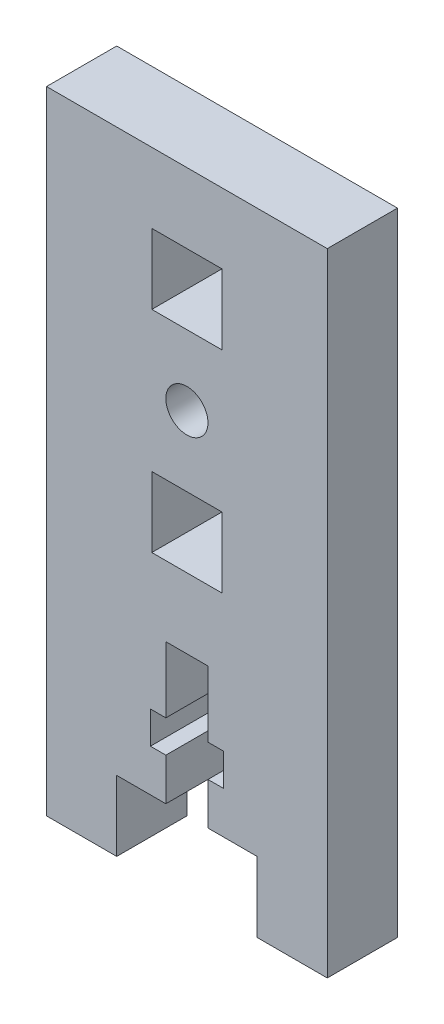
ISO-10303-21;
HEADER;
FILE_DESCRIPTION(('STEP AP214'),'2;1');
FILE_NAME('part.step','',(''),(''),'','','');
FILE_SCHEMA(('AUTOMOTIVE_DESIGN { 1 0 10303 214 1 1 1 1 }'));
ENDSEC;
DATA;
#1=APPLICATION_CONTEXT('core data for automotive mechanical design processes');
#2=APPLICATION_PROTOCOL_DEFINITION('international standard','automotive_design',2000,#1);
#3=PRODUCT_CONTEXT('',#1,'mechanical');
#4=PRODUCT('Part','Part','',(#3));
#5=PRODUCT_RELATED_PRODUCT_CATEGORY('part','',(#4));
#6=PRODUCT_DEFINITION_FORMATION('','',#4);
#7=PRODUCT_DEFINITION_CONTEXT('part definition',#1,'design');
#8=PRODUCT_DEFINITION('design','',#6,#7);
#9=PRODUCT_DEFINITION_SHAPE('','',#8);
#10=(LENGTH_UNIT() NAMED_UNIT(*) SI_UNIT(.MILLI.,.METRE.));
#11=(NAMED_UNIT(*) PLANE_ANGLE_UNIT() SI_UNIT($,.RADIAN.));
#12=(NAMED_UNIT(*) SI_UNIT($,.STERADIAN.) SOLID_ANGLE_UNIT());
#13=UNCERTAINTY_MEASURE_WITH_UNIT(LENGTH_MEASURE(1.E-05),#10,'distance_accuracy_value','');
#14=(GEOMETRIC_REPRESENTATION_CONTEXT(3) GLOBAL_UNCERTAINTY_ASSIGNED_CONTEXT((#13)) GLOBAL_UNIT_ASSIGNED_CONTEXT((#10,
#11,#12)) REPRESENTATION_CONTEXT('',''));
#15=CARTESIAN_POINT('',(0.,0.,0.));
#16=DIRECTION('',(0.,0.,1.));
#17=DIRECTION('',(1.,0.,0.));
#18=AXIS2_PLACEMENT_3D('',#15,#16,#17);
#19=CARTESIAN_POINT('',(0.,0.,5.));
#20=DIRECTION('',(0.,0.,-1.));
#21=DIRECTION('',(-1.,0.,0.));
#22=AXIS2_PLACEMENT_3D('',#19,#20,#21);
#23=PLANE('',#22);
#24=DIRECTION('',(-1.,0.,0.));
#25=VECTOR('',#24,1.);
#26=CARTESIAN_POINT('',(7.50000000000001,20.,5.));
#27=LINE('',#26,#25);
#28=CARTESIAN_POINT('',(12.5,20.,5.));
#29=VERTEX_POINT('',#28);
#30=CARTESIAN_POINT('',(7.50000000000001,20.,5.));
#31=VERTEX_POINT('',#30);
#32=EDGE_CURVE('E258',#29,#31,#27,.T.);
#33=ORIENTED_EDGE('',*,*,#32,.F.);
#34=DIRECTION('',(0.,1.,0.));
#35=VECTOR('',#34,1.);
#36=CARTESIAN_POINT('',(12.5,20.,5.));
#37=LINE('',#36,#35);
#38=CARTESIAN_POINT('',(12.5,15.,5.));
#39=VERTEX_POINT('',#38);
#40=EDGE_CURVE('E266',#39,#29,#37,.T.);
#41=ORIENTED_EDGE('',*,*,#40,.F.);
#42=DIRECTION('',(1.,0.,0.));
#43=VECTOR('',#42,1.);
#44=CARTESIAN_POINT('',(7.50000000000001,15.,5.));
#45=LINE('',#44,#43);
#46=CARTESIAN_POINT('',(7.50000000000001,15.,5.));
#47=VERTEX_POINT('',#46);
#48=EDGE_CURVE('E263',#47,#39,#45,.T.);
#49=ORIENTED_EDGE('',*,*,#48,.F.);
#50=DIRECTION('',(0.,-1.,0.));
#51=VECTOR('',#50,1.);
#52=CARTESIAN_POINT('',(7.50000000000001,20.,5.));
#53=LINE('',#52,#51);
#54=EDGE_CURVE('E260',#31,#47,#53,.T.);
#55=ORIENTED_EDGE('',*,*,#54,.F.);
#56=EDGE_LOOP('',(#33,#41,#49,#55));
#57=FACE_BOUND('',#56,.T.);
#58=DIRECTION('',(0.,-1.,0.));
#59=VECTOR('',#58,1.);
#60=CARTESIAN_POINT('',(0.,-5.,5.));
#61=LINE('',#60,#59);
#62=CARTESIAN_POINT('',(0.,40.,5.));
#63=VERTEX_POINT('',#62);
#64=CARTESIAN_POINT('',(0.,-5.,5.));
#65=VERTEX_POINT('',#64);
#66=EDGE_CURVE('E289',#63,#65,#61,.T.);
#67=ORIENTED_EDGE('',*,*,#66,.T.);
#68=DIRECTION('',(1.,0.,0.));
#69=VECTOR('',#68,1.);
#70=CARTESIAN_POINT('',(5.,-5.,5.));
#71=LINE('',#70,#69);
#72=CARTESIAN_POINT('',(5.,-5.,5.));
#73=VERTEX_POINT('',#72);
#74=EDGE_CURVE('E292',#65,#73,#71,.T.);
#75=ORIENTED_EDGE('',*,*,#74,.T.);
#76=DIRECTION('',(0.,1.,0.));
#77=VECTOR('',#76,1.);
#78=CARTESIAN_POINT('',(5.,-5.,5.));
#79=LINE('',#78,#77);
#80=CARTESIAN_POINT('',(5.,0.,5.));
#81=VERTEX_POINT('',#80);
#82=EDGE_CURVE('E295',#73,#81,#79,.T.);
#83=ORIENTED_EDGE('',*,*,#82,.T.);
#84=DIRECTION('',(1.,0.,0.));
#85=VECTOR('',#84,1.);
#86=CARTESIAN_POINT('',(8.50000000000001,0.,5.));
#87=LINE('',#86,#85);
#88=CARTESIAN_POINT('',(8.50000000000001,0.,5.));
#89=VERTEX_POINT('',#88);
#90=EDGE_CURVE('E297',#81,#89,#87,.T.);
#91=ORIENTED_EDGE('',*,*,#90,.T.);
#92=DIRECTION('',(0.,1.,0.));
#93=VECTOR('',#92,1.);
#94=CARTESIAN_POINT('',(8.5,3.,5.));
#95=LINE('',#94,#93);
#96=CARTESIAN_POINT('',(8.5,3.,5.));
#97=VERTEX_POINT('',#96);
#98=EDGE_CURVE('E299',#89,#97,#95,.T.);
#99=ORIENTED_EDGE('',*,*,#98,.T.);
#100=DIRECTION('',(-1.,0.,0.));
#101=VECTOR('',#100,1.);
#102=CARTESIAN_POINT('',(8.5,3.,5.));
#103=LINE('',#102,#101);
#104=CARTESIAN_POINT('',(7.4,3.00000000000001,5.));
#105=VERTEX_POINT('',#104);
#106=EDGE_CURVE('E301',#97,#105,#103,.T.);
#107=ORIENTED_EDGE('',*,*,#106,.T.);
#108=DIRECTION('',(0.,1.,0.));
#109=VECTOR('',#108,1.);
#110=CARTESIAN_POINT('',(7.4,3.00000000000001,5.));
#111=LINE('',#110,#109);
#112=CARTESIAN_POINT('',(7.4,5.3,5.));
#113=VERTEX_POINT('',#112);
#114=EDGE_CURVE('E303',#105,#113,#111,.T.);
#115=ORIENTED_EDGE('',*,*,#114,.T.);
#116=DIRECTION('',(1.,0.,0.));
#117=VECTOR('',#116,1.);
#118=CARTESIAN_POINT('',(7.4,5.3,5.));
#119=LINE('',#118,#117);
#120=CARTESIAN_POINT('',(8.5,5.29999999999999,5.));
#121=VERTEX_POINT('',#120);
#122=EDGE_CURVE('E305',#113,#121,#119,.T.);
#123=ORIENTED_EDGE('',*,*,#122,.T.);
#124=DIRECTION('',(0.,1.,0.));
#125=VECTOR('',#124,1.);
#126=CARTESIAN_POINT('',(8.5,10.,5.));
#127=LINE('',#126,#125);
#128=CARTESIAN_POINT('',(8.5,10.,5.));
#129=VERTEX_POINT('',#128);
#130=EDGE_CURVE('E307',#121,#129,#127,.T.);
#131=ORIENTED_EDGE('',*,*,#130,.T.);
#132=DIRECTION('',(1.,0.,0.));
#133=VECTOR('',#132,1.);
#134=CARTESIAN_POINT('',(11.5,10.,5.));
#135=LINE('',#134,#133);
#136=CARTESIAN_POINT('',(11.5,10.,5.));
#137=VERTEX_POINT('',#136);
#138=EDGE_CURVE('E309',#129,#137,#135,.T.);
#139=ORIENTED_EDGE('',*,*,#138,.T.);
#140=DIRECTION('',(0.,-1.,0.));
#141=VECTOR('',#140,1.);
#142=CARTESIAN_POINT('',(11.5,5.29999999999999,5.));
#143=LINE('',#142,#141);
#144=CARTESIAN_POINT('',(11.5,5.29999999999999,5.));
#145=VERTEX_POINT('',#144);
#146=EDGE_CURVE('E311',#137,#145,#143,.T.);
#147=ORIENTED_EDGE('',*,*,#146,.T.);
#148=DIRECTION('',(1.,0.,0.));
#149=VECTOR('',#148,1.);
#150=CARTESIAN_POINT('',(11.5,5.29999999999999,5.));
#151=LINE('',#150,#149);
#152=CARTESIAN_POINT('',(12.6,5.3,5.));
#153=VERTEX_POINT('',#152);
#154=EDGE_CURVE('E313',#145,#153,#151,.T.);
#155=ORIENTED_EDGE('',*,*,#154,.T.);
#156=DIRECTION('',(0.,-1.,0.));
#157=VECTOR('',#156,1.);
#158=CARTESIAN_POINT('',(12.6,5.3,5.));
#159=LINE('',#158,#157);
#160=CARTESIAN_POINT('',(12.6,3.,5.));
#161=VERTEX_POINT('',#160);
#162=EDGE_CURVE('E315',#153,#161,#159,.T.);
#163=ORIENTED_EDGE('',*,*,#162,.T.);
#164=DIRECTION('',(-1.,0.,0.));
#165=VECTOR('',#164,1.);
#166=CARTESIAN_POINT('',(12.6,3.,5.));
#167=LINE('',#166,#165);
#168=CARTESIAN_POINT('',(11.5,3.,5.));
#169=VERTEX_POINT('',#168);
#170=EDGE_CURVE('E317',#161,#169,#167,.T.);
#171=ORIENTED_EDGE('',*,*,#170,.T.);
#172=DIRECTION('',(0.,-1.,0.));
#173=VECTOR('',#172,1.);
#174=CARTESIAN_POINT('',(11.5,0.,5.));
#175=LINE('',#174,#173);
#176=CARTESIAN_POINT('',(11.5,0.,5.));
#177=VERTEX_POINT('',#176);
#178=EDGE_CURVE('E319',#169,#177,#175,.T.);
#179=ORIENTED_EDGE('',*,*,#178,.T.);
#180=DIRECTION('',(1.,0.,0.));
#181=VECTOR('',#180,1.);
#182=CARTESIAN_POINT('',(11.5,0.,5.));
#183=LINE('',#182,#181);
#184=CARTESIAN_POINT('',(15.,0.,5.));
#185=VERTEX_POINT('',#184);
#186=EDGE_CURVE('E321',#177,#185,#183,.T.);
#187=ORIENTED_EDGE('',*,*,#186,.T.);
#188=DIRECTION('',(0.,-1.,0.));
#189=VECTOR('',#188,1.);
#190=CARTESIAN_POINT('',(15.,0.,5.));
#191=LINE('',#190,#189);
#192=CARTESIAN_POINT('',(15.,-5.,5.));
#193=VERTEX_POINT('',#192);
#194=EDGE_CURVE('E323',#185,#193,#191,.T.);
#195=ORIENTED_EDGE('',*,*,#194,.T.);
#196=DIRECTION('',(1.,0.,0.));
#197=VECTOR('',#196,1.);
#198=CARTESIAN_POINT('',(15.,-5.,5.));
#199=LINE('',#198,#197);
#200=CARTESIAN_POINT('',(20.,-5.,5.));
#201=VERTEX_POINT('',#200);
#202=EDGE_CURVE('E325',#193,#201,#199,.T.);
#203=ORIENTED_EDGE('',*,*,#202,.T.);
#204=DIRECTION('',(0.,1.,0.));
#205=VECTOR('',#204,1.);
#206=CARTESIAN_POINT('',(20.,-5.,5.));
#207=LINE('',#206,#205);
#208=CARTESIAN_POINT('',(20.,40.,5.));
#209=VERTEX_POINT('',#208);
#210=EDGE_CURVE('E327',#201,#209,#207,.T.);
#211=ORIENTED_EDGE('',*,*,#210,.T.);
#212=DIRECTION('',(-1.,0.,0.));
#213=VECTOR('',#212,1.);
#214=CARTESIAN_POINT('',(0.,40.,5.));
#215=LINE('',#214,#213);
#216=EDGE_CURVE('E329',#209,#63,#215,.T.);
#217=ORIENTED_EDGE('',*,*,#216,.T.);
#218=EDGE_LOOP('',(#67,#75,#83,#91,#99,#107,#115,#123,#131,#139,#147,#155,#163,#171,#179,#187,
#195,#203,#211,#217));
#219=FACE_BOUND('',#218,.T.);
#220=DIRECTION('',(1.,0.,0.));
#221=VECTOR('',#220,1.);
#222=CARTESIAN_POINT('',(7.50000000000001,30.,5.));
#223=LINE('',#222,#221);
#224=CARTESIAN_POINT('',(7.50000000000001,30.,5.));
#225=VERTEX_POINT('',#224);
#226=CARTESIAN_POINT('',(12.5,30.,5.));
#227=VERTEX_POINT('',#226);
#228=EDGE_CURVE('E219',#225,#227,#223,.T.);
#229=ORIENTED_EDGE('',*,*,#228,.F.);
#230=DIRECTION('',(0.,-1.,0.));
#231=VECTOR('',#230,1.);
#232=CARTESIAN_POINT('',(7.50000000000001,30.,5.));
#233=LINE('',#232,#231);
#234=CARTESIAN_POINT('',(7.50000000000001,35.,5.));
#235=VERTEX_POINT('',#234);
#236=EDGE_CURVE('E242',#235,#225,#233,.T.);
#237=ORIENTED_EDGE('',*,*,#236,.F.);
#238=DIRECTION('',(-1.,0.,0.));
#239=VECTOR('',#238,1.);
#240=CARTESIAN_POINT('',(7.50000000000001,35.,5.));
#241=LINE('',#240,#239);
#242=CARTESIAN_POINT('',(12.5,35.,5.));
#243=VERTEX_POINT('',#242);
#244=EDGE_CURVE('E240',#243,#235,#241,.T.);
#245=ORIENTED_EDGE('',*,*,#244,.F.);
#246=DIRECTION('',(0.,1.,0.));
#247=VECTOR('',#246,1.);
#248=CARTESIAN_POINT('',(12.5,30.,5.));
#249=LINE('',#248,#247);
#250=EDGE_CURVE('E227',#227,#243,#249,.T.);
#251=ORIENTED_EDGE('',*,*,#250,.F.);
#252=EDGE_LOOP('',(#229,#237,#245,#251));
#253=FACE_BOUND('',#252,.T.);
#254=CARTESIAN_POINT('',(10.,25.,5.));
#255=DIRECTION('',(0.,0.,1.));
#256=DIRECTION('',(1.,0.,0.));
#257=AXIS2_PLACEMENT_3D('',#254,#255,#256);
#258=CIRCLE('',#257,1.5);
#259=CARTESIAN_POINT('',(11.5,25.,5.));
#260=VERTEX_POINT('',#259);
#261=EDGE_CURVE('E248',#260,#260,#258,.T.);
#262=ORIENTED_EDGE('',*,*,#261,.F.);
#263=EDGE_LOOP('',(#262));
#264=FACE_BOUND('',#263,.T.);
#265=ADVANCED_FACE('F34',(#57,#219,#253,#264),#23,.F.);
#266=CARTESIAN_POINT('',(0.,0.,0.));
#267=DIRECTION('',(0.,0.,-1.));
#268=DIRECTION('',(-1.,0.,0.));
#269=AXIS2_PLACEMENT_3D('',#266,#267,#268);
#270=PLANE('',#269);
#271=DIRECTION('',(0.,-1.,0.));
#272=VECTOR('',#271,1.);
#273=CARTESIAN_POINT('',(7.50000000000001,30.,0.));
#274=LINE('',#273,#272);
#275=CARTESIAN_POINT('',(7.50000000000001,35.,0.));
#276=VERTEX_POINT('',#275);
#277=CARTESIAN_POINT('',(7.50000000000001,30.,0.));
#278=VERTEX_POINT('',#277);
#279=EDGE_CURVE('E228',#276,#278,#274,.T.);
#280=ORIENTED_EDGE('',*,*,#279,.T.);
#281=DIRECTION('',(1.,0.,0.));
#282=VECTOR('',#281,1.);
#283=CARTESIAN_POINT('',(7.50000000000001,30.,0.));
#284=LINE('',#283,#282);
#285=CARTESIAN_POINT('',(12.5,30.,0.));
#286=VERTEX_POINT('',#285);
#287=EDGE_CURVE('E57',#278,#286,#284,.T.);
#288=ORIENTED_EDGE('',*,*,#287,.T.);
#289=DIRECTION('',(0.,1.,0.));
#290=VECTOR('',#289,1.);
#291=CARTESIAN_POINT('',(12.5,30.,0.));
#292=LINE('',#291,#290);
#293=CARTESIAN_POINT('',(12.5,35.,0.));
#294=VERTEX_POINT('',#293);
#295=EDGE_CURVE('E234',#286,#294,#292,.T.);
#296=ORIENTED_EDGE('',*,*,#295,.T.);
#297=DIRECTION('',(-1.,0.,0.));
#298=VECTOR('',#297,1.);
#299=CARTESIAN_POINT('',(7.50000000000001,35.,0.));
#300=LINE('',#299,#298);
#301=EDGE_CURVE('E250',#294,#276,#300,.T.);
#302=ORIENTED_EDGE('',*,*,#301,.T.);
#303=EDGE_LOOP('',(#280,#288,#296,#302));
#304=FACE_BOUND('',#303,.T.);
#305=DIRECTION('',(0.,1.,0.));
#306=VECTOR('',#305,1.);
#307=CARTESIAN_POINT('',(12.5,20.,0.));
#308=LINE('',#307,#306);
#309=CARTESIAN_POINT('',(12.5,15.,0.));
#310=VERTEX_POINT('',#309);
#311=CARTESIAN_POINT('',(12.5,20.,0.));
#312=VERTEX_POINT('',#311);
#313=EDGE_CURVE('E261',#310,#312,#308,.T.);
#314=ORIENTED_EDGE('',*,*,#313,.T.);
#315=DIRECTION('',(-1.,0.,0.));
#316=VECTOR('',#315,1.);
#317=CARTESIAN_POINT('',(7.50000000000001,20.,0.));
#318=LINE('',#317,#316);
#319=CARTESIAN_POINT('',(7.50000000000001,20.,0.));
#320=VERTEX_POINT('',#319);
#321=EDGE_CURVE('E235',#312,#320,#318,.T.);
#322=ORIENTED_EDGE('',*,*,#321,.T.);
#323=DIRECTION('',(0.,-1.,0.));
#324=VECTOR('',#323,1.);
#325=CARTESIAN_POINT('',(7.50000000000001,20.,0.));
#326=LINE('',#325,#324);
#327=CARTESIAN_POINT('',(7.50000000000001,15.,0.));
#328=VERTEX_POINT('',#327);
#329=EDGE_CURVE('E271',#320,#328,#326,.T.);
#330=ORIENTED_EDGE('',*,*,#329,.T.);
#331=DIRECTION('',(1.,0.,0.));
#332=VECTOR('',#331,1.);
#333=CARTESIAN_POINT('',(7.50000000000001,15.,0.));
#334=LINE('',#333,#332);
#335=EDGE_CURVE('E274',#328,#310,#334,.T.);
#336=ORIENTED_EDGE('',*,*,#335,.T.);
#337=EDGE_LOOP('',(#314,#322,#330,#336));
#338=FACE_BOUND('',#337,.T.);
#339=DIRECTION('',(1.,0.,0.));
#340=VECTOR('',#339,1.);
#341=CARTESIAN_POINT('',(5.,-5.,0.));
#342=LINE('',#341,#340);
#343=CARTESIAN_POINT('',(0.,-5.,0.));
#344=VERTEX_POINT('',#343);
#345=CARTESIAN_POINT('',(5.,-5.,0.));
#346=VERTEX_POINT('',#345);
#347=EDGE_CURVE('E288',#344,#346,#342,.T.);
#348=ORIENTED_EDGE('',*,*,#347,.F.);
#349=DIRECTION('',(0.,-1.,0.));
#350=VECTOR('',#349,1.);
#351=CARTESIAN_POINT('',(0.,0.,0.));
#352=LINE('',#351,#350);
#353=CARTESIAN_POINT('',(0.,40.,0.));
#354=VERTEX_POINT('',#353);
#355=EDGE_CURVE('E293',#354,#344,#352,.T.);
#356=ORIENTED_EDGE('',*,*,#355,.F.);
#357=DIRECTION('',(-1.,0.,0.));
#358=VECTOR('',#357,1.);
#359=CARTESIAN_POINT('',(0.,40.,0.));
#360=LINE('',#359,#358);
#361=CARTESIAN_POINT('',(20.,40.,0.));
#362=VERTEX_POINT('',#361);
#363=EDGE_CURVE('E369',#362,#354,#360,.T.);
#364=ORIENTED_EDGE('',*,*,#363,.F.);
#365=DIRECTION('',(0.,1.,0.));
#366=VECTOR('',#365,1.);
#367=CARTESIAN_POINT('',(20.,0.,0.));
#368=LINE('',#367,#366);
#369=CARTESIAN_POINT('',(20.,-5.,0.));
#370=VERTEX_POINT('',#369);
#371=EDGE_CURVE('E367',#370,#362,#368,.T.);
#372=ORIENTED_EDGE('',*,*,#371,.F.);
#373=DIRECTION('',(1.,0.,0.));
#374=VECTOR('',#373,1.);
#375=CARTESIAN_POINT('',(15.,-5.,0.));
#376=LINE('',#375,#374);
#377=CARTESIAN_POINT('',(15.,-5.,0.));
#378=VERTEX_POINT('',#377);
#379=EDGE_CURVE('E364',#378,#370,#376,.T.);
#380=ORIENTED_EDGE('',*,*,#379,.F.);
#381=DIRECTION('',(0.,-1.,0.));
#382=VECTOR('',#381,1.);
#383=CARTESIAN_POINT('',(15.,0.,0.));
#384=LINE('',#383,#382);
#385=CARTESIAN_POINT('',(15.,0.,0.));
#386=VERTEX_POINT('',#385);
#387=EDGE_CURVE('E362',#386,#378,#384,.T.);
#388=ORIENTED_EDGE('',*,*,#387,.F.);
#389=DIRECTION('',(1.,0.,0.));
#390=VECTOR('',#389,1.);
#391=CARTESIAN_POINT('',(11.5,0.,0.));
#392=LINE('',#391,#390);
#393=CARTESIAN_POINT('',(11.5,0.,0.));
#394=VERTEX_POINT('',#393);
#395=EDGE_CURVE('E360',#394,#386,#392,.T.);
#396=ORIENTED_EDGE('',*,*,#395,.F.);
#397=DIRECTION('',(0.,-1.,0.));
#398=VECTOR('',#397,1.);
#399=CARTESIAN_POINT('',(11.5,0.,0.));
#400=LINE('',#399,#398);
#401=CARTESIAN_POINT('',(11.5,3.,0.));
#402=VERTEX_POINT('',#401);
#403=EDGE_CURVE('E358',#402,#394,#400,.T.);
#404=ORIENTED_EDGE('',*,*,#403,.F.);
#405=DIRECTION('',(-1.,0.,0.));
#406=VECTOR('',#405,1.);
#407=CARTESIAN_POINT('',(12.6,3.,0.));
#408=LINE('',#407,#406);
#409=CARTESIAN_POINT('',(12.6,3.,0.));
#410=VERTEX_POINT('',#409);
#411=EDGE_CURVE('E356',#410,#402,#408,.T.);
#412=ORIENTED_EDGE('',*,*,#411,.F.);
#413=DIRECTION('',(0.,-1.,0.));
#414=VECTOR('',#413,1.);
#415=CARTESIAN_POINT('',(12.6,5.3,0.));
#416=LINE('',#415,#414);
#417=CARTESIAN_POINT('',(12.6,5.3,0.));
#418=VERTEX_POINT('',#417);
#419=EDGE_CURVE('E354',#418,#410,#416,.T.);
#420=ORIENTED_EDGE('',*,*,#419,.F.);
#421=DIRECTION('',(1.,0.,0.));
#422=VECTOR('',#421,1.);
#423=CARTESIAN_POINT('',(11.5,5.29999999999999,0.));
#424=LINE('',#423,#422);
#425=CARTESIAN_POINT('',(11.5,5.29999999999999,0.));
#426=VERTEX_POINT('',#425);
#427=EDGE_CURVE('E352',#426,#418,#424,.T.);
#428=ORIENTED_EDGE('',*,*,#427,.F.);
#429=DIRECTION('',(0.,-1.,0.));
#430=VECTOR('',#429,1.);
#431=CARTESIAN_POINT('',(11.5,5.29999999999999,0.));
#432=LINE('',#431,#430);
#433=CARTESIAN_POINT('',(11.5,10.,0.));
#434=VERTEX_POINT('',#433);
#435=EDGE_CURVE('E350',#434,#426,#432,.T.);
#436=ORIENTED_EDGE('',*,*,#435,.F.);
#437=DIRECTION('',(1.,0.,0.));
#438=VECTOR('',#437,1.);
#439=CARTESIAN_POINT('',(11.5,10.,0.));
#440=LINE('',#439,#438);
#441=CARTESIAN_POINT('',(8.5,10.,0.));
#442=VERTEX_POINT('',#441);
#443=EDGE_CURVE('E348',#442,#434,#440,.T.);
#444=ORIENTED_EDGE('',*,*,#443,.F.);
#445=DIRECTION('',(0.,1.,0.));
#446=VECTOR('',#445,1.);
#447=CARTESIAN_POINT('',(8.5,10.,0.));
#448=LINE('',#447,#446);
#449=CARTESIAN_POINT('',(8.5,5.29999999999999,0.));
#450=VERTEX_POINT('',#449);
#451=EDGE_CURVE('E346',#450,#442,#448,.T.);
#452=ORIENTED_EDGE('',*,*,#451,.F.);
#453=DIRECTION('',(1.,0.,0.));
#454=VECTOR('',#453,1.);
#455=CARTESIAN_POINT('',(7.4,5.3,0.));
#456=LINE('',#455,#454);
#457=CARTESIAN_POINT('',(7.4,5.3,0.));
#458=VERTEX_POINT('',#457);
#459=EDGE_CURVE('E344',#458,#450,#456,.T.);
#460=ORIENTED_EDGE('',*,*,#459,.F.);
#461=DIRECTION('',(0.,1.,0.));
#462=VECTOR('',#461,1.);
#463=CARTESIAN_POINT('',(7.4,3.00000000000001,0.));
#464=LINE('',#463,#462);
#465=CARTESIAN_POINT('',(7.4,3.00000000000001,0.));
#466=VERTEX_POINT('',#465);
#467=EDGE_CURVE('E342',#466,#458,#464,.T.);
#468=ORIENTED_EDGE('',*,*,#467,.F.);
#469=DIRECTION('',(-1.,0.,0.));
#470=VECTOR('',#469,1.);
#471=CARTESIAN_POINT('',(8.5,3.,0.));
#472=LINE('',#471,#470);
#473=CARTESIAN_POINT('',(8.5,3.,0.));
#474=VERTEX_POINT('',#473);
#475=EDGE_CURVE('E340',#474,#466,#472,.T.);
#476=ORIENTED_EDGE('',*,*,#475,.F.);
#477=DIRECTION('',(0.,1.,0.));
#478=VECTOR('',#477,1.);
#479=CARTESIAN_POINT('',(8.5,3.,0.));
#480=LINE('',#479,#478);
#481=CARTESIAN_POINT('',(8.50000000000001,0.,0.));
#482=VERTEX_POINT('',#481);
#483=EDGE_CURVE('E338',#482,#474,#480,.T.);
#484=ORIENTED_EDGE('',*,*,#483,.F.);
#485=DIRECTION('',(1.,0.,0.));
#486=VECTOR('',#485,1.);
#487=CARTESIAN_POINT('',(8.50000000000001,0.,0.));
#488=LINE('',#487,#486);
#489=CARTESIAN_POINT('',(5.,0.,0.));
#490=VERTEX_POINT('',#489);
#491=EDGE_CURVE('E336',#490,#482,#488,.T.);
#492=ORIENTED_EDGE('',*,*,#491,.F.);
#493=DIRECTION('',(0.,1.,0.));
#494=VECTOR('',#493,1.);
#495=CARTESIAN_POINT('',(5.,-5.,0.));
#496=LINE('',#495,#494);
#497=EDGE_CURVE('E334',#346,#490,#496,.T.);
#498=ORIENTED_EDGE('',*,*,#497,.F.);
#499=EDGE_LOOP('',(#348,#356,#364,#372,#380,#388,#396,#404,#412,#420,#428,#436,#444,#452,#460,
#468,#476,#484,#492,#498));
#500=FACE_BOUND('',#499,.T.);
#501=CARTESIAN_POINT('',(10.,25.,0.));
#502=DIRECTION('',(0.,0.,1.));
#503=DIRECTION('',(1.,0.,0.));
#504=AXIS2_PLACEMENT_3D('',#501,#502,#503);
#505=CIRCLE('',#504,1.5);
#506=CARTESIAN_POINT('',(11.5,25.,0.));
#507=VERTEX_POINT('',#506);
#508=EDGE_CURVE('E798',#507,#507,#505,.T.);
#509=ORIENTED_EDGE('',*,*,#508,.T.);
#510=EDGE_LOOP('',(#509));
#511=FACE_BOUND('',#510,.T.);
#512=ADVANCED_FACE('F435',(#304,#338,#500,#511),#270,.T.);
#513=CARTESIAN_POINT('',(5.,-5.,5.));
#514=DIRECTION('',(0.,1.,0.));
#515=DIRECTION('',(0.,0.,1.));
#516=AXIS2_PLACEMENT_3D('',#513,#514,#515);
#517=PLANE('',#516);
#518=ORIENTED_EDGE('',*,*,#347,.T.);
#519=DIRECTION('',(0.,0.,-1.));
#520=VECTOR('',#519,1.);
#521=CARTESIAN_POINT('',(5.,-5.,5.));
#522=LINE('',#521,#520);
#523=EDGE_CURVE('E42',#73,#346,#522,.T.);
#524=ORIENTED_EDGE('',*,*,#523,.F.);
#525=ORIENTED_EDGE('',*,*,#74,.F.);
#526=DIRECTION('',(0.,0.,-1.));
#527=VECTOR('',#526,1.);
#528=CARTESIAN_POINT('',(0.,-5.,5.));
#529=LINE('',#528,#527);
#530=EDGE_CURVE('E11',#65,#344,#529,.T.);
#531=ORIENTED_EDGE('',*,*,#530,.T.);
#532=EDGE_LOOP('',(#518,#524,#525,#531));
#533=FACE_BOUND('',#532,.T.);
#534=ADVANCED_FACE('F36',(#533),#517,.F.);
#535=CARTESIAN_POINT('',(5.,-5.,5.));
#536=DIRECTION('',(-1.,0.,0.));
#537=DIRECTION('',(0.,-1.,0.));
#538=AXIS2_PLACEMENT_3D('',#535,#536,#537);
#539=PLANE('',#538);
#540=ORIENTED_EDGE('',*,*,#497,.T.);
#541=DIRECTION('',(0.,0.,-1.));
#542=VECTOR('',#541,1.);
#543=CARTESIAN_POINT('',(5.,0.,5.));
#544=LINE('',#543,#542);
#545=EDGE_CURVE('E422',#81,#490,#544,.T.);
#546=ORIENTED_EDGE('',*,*,#545,.F.);
#547=ORIENTED_EDGE('',*,*,#82,.F.);
#548=ORIENTED_EDGE('',*,*,#523,.T.);
#549=EDGE_LOOP('',(#540,#546,#547,#548));
#550=FACE_BOUND('',#549,.T.);
#551=ADVANCED_FACE('F429',(#550),#539,.F.);
#552=CARTESIAN_POINT('',(8.50000000000001,0.,5.));
#553=DIRECTION('',(0.,1.,0.));
#554=DIRECTION('',(-1.,0.,0.));
#555=AXIS2_PLACEMENT_3D('',#552,#553,#554);
#556=PLANE('',#555);
#557=ORIENTED_EDGE('',*,*,#491,.T.);
#558=DIRECTION('',(0.,0.,-1.));
#559=VECTOR('',#558,1.);
#560=CARTESIAN_POINT('',(8.50000000000001,0.,5.));
#561=LINE('',#560,#559);
#562=EDGE_CURVE('E419',#89,#482,#561,.T.);
#563=ORIENTED_EDGE('',*,*,#562,.F.);
#564=ORIENTED_EDGE('',*,*,#90,.F.);
#565=ORIENTED_EDGE('',*,*,#545,.T.);
#566=EDGE_LOOP('',(#557,#563,#564,#565));
#567=FACE_BOUND('',#566,.T.);
#568=ADVANCED_FACE('F442',(#567),#556,.F.);
#569=CARTESIAN_POINT('',(8.5,3.,5.));
#570=DIRECTION('',(-1.,0.,0.));
#571=DIRECTION('',(0.,-1.,0.));
#572=AXIS2_PLACEMENT_3D('',#569,#570,#571);
#573=PLANE('',#572);
#574=ORIENTED_EDGE('',*,*,#483,.T.);
#575=DIRECTION('',(0.,0.,-1.));
#576=VECTOR('',#575,1.);
#577=CARTESIAN_POINT('',(8.5,3.,5.));
#578=LINE('',#577,#576);
#579=EDGE_CURVE('E416',#97,#474,#578,.T.);
#580=ORIENTED_EDGE('',*,*,#579,.F.);
#581=ORIENTED_EDGE('',*,*,#98,.F.);
#582=ORIENTED_EDGE('',*,*,#562,.T.);
#583=EDGE_LOOP('',(#574,#580,#581,#582));
#584=FACE_BOUND('',#583,.T.);
#585=ADVANCED_FACE('F446',(#584),#573,.F.);
#586=CARTESIAN_POINT('',(8.5,3.,5.));
#587=DIRECTION('',(0.,-1.,0.));
#588=DIRECTION('',(1.,0.,0.));
#589=AXIS2_PLACEMENT_3D('',#586,#587,#588);
#590=PLANE('',#589);
#591=ORIENTED_EDGE('',*,*,#475,.T.);
#592=DIRECTION('',(0.,0.,-1.));
#593=VECTOR('',#592,1.);
#594=CARTESIAN_POINT('',(7.4,3.00000000000001,5.));
#595=LINE('',#594,#593);
#596=EDGE_CURVE('E413',#105,#466,#595,.T.);
#597=ORIENTED_EDGE('',*,*,#596,.F.);
#598=ORIENTED_EDGE('',*,*,#106,.F.);
#599=ORIENTED_EDGE('',*,*,#579,.T.);
#600=EDGE_LOOP('',(#591,#597,#598,#599));
#601=FACE_BOUND('',#600,.T.);
#602=ADVANCED_FACE('F524',(#601),#590,.F.);
#603=CARTESIAN_POINT('',(7.4,3.00000000000001,5.));
#604=DIRECTION('',(-1.,0.,0.));
#605=DIRECTION('',(0.,-1.,0.));
#606=AXIS2_PLACEMENT_3D('',#603,#604,#605);
#607=PLANE('',#606);
#608=ORIENTED_EDGE('',*,*,#467,.T.);
#609=DIRECTION('',(0.,0.,-1.));
#610=VECTOR('',#609,1.);
#611=CARTESIAN_POINT('',(7.4,5.3,5.));
#612=LINE('',#611,#610);
#613=EDGE_CURVE('E410',#113,#458,#612,.T.);
#614=ORIENTED_EDGE('',*,*,#613,.F.);
#615=ORIENTED_EDGE('',*,*,#114,.F.);
#616=ORIENTED_EDGE('',*,*,#596,.T.);
#617=EDGE_LOOP('',(#608,#614,#615,#616));
#618=FACE_BOUND('',#617,.T.);
#619=ADVANCED_FACE('F522',(#618),#607,.F.);
#620=CARTESIAN_POINT('',(7.4,5.3,5.));
#621=DIRECTION('',(0.,1.,0.));
#622=DIRECTION('',(-1.,0.,0.));
#623=AXIS2_PLACEMENT_3D('',#620,#621,#622);
#624=PLANE('',#623);
#625=ORIENTED_EDGE('',*,*,#459,.T.);
#626=DIRECTION('',(0.,0.,-1.));
#627=VECTOR('',#626,1.);
#628=CARTESIAN_POINT('',(8.5,5.29999999999999,5.));
#629=LINE('',#628,#627);
#630=EDGE_CURVE('E407',#121,#450,#629,.T.);
#631=ORIENTED_EDGE('',*,*,#630,.F.);
#632=ORIENTED_EDGE('',*,*,#122,.F.);
#633=ORIENTED_EDGE('',*,*,#613,.T.);
#634=EDGE_LOOP('',(#625,#631,#632,#633));
#635=FACE_BOUND('',#634,.T.);
#636=ADVANCED_FACE('F517',(#635),#624,.F.);
#637=CARTESIAN_POINT('',(8.5,10.,5.));
#638=DIRECTION('',(-1.,0.,0.));
#639=DIRECTION('',(0.,-1.,0.));
#640=AXIS2_PLACEMENT_3D('',#637,#638,#639);
#641=PLANE('',#640);
#642=ORIENTED_EDGE('',*,*,#451,.T.);
#643=DIRECTION('',(0.,0.,-1.));
#644=VECTOR('',#643,1.);
#645=CARTESIAN_POINT('',(8.5,10.,5.));
#646=LINE('',#645,#644);
#647=EDGE_CURVE('E404',#129,#442,#646,.T.);
#648=ORIENTED_EDGE('',*,*,#647,.F.);
#649=ORIENTED_EDGE('',*,*,#130,.F.);
#650=ORIENTED_EDGE('',*,*,#630,.T.);
#651=EDGE_LOOP('',(#642,#648,#649,#650));
#652=FACE_BOUND('',#651,.T.);
#653=ADVANCED_FACE('F512',(#652),#641,.F.);
#654=CARTESIAN_POINT('',(11.5,10.,5.));
#655=DIRECTION('',(0.,1.,0.));
#656=DIRECTION('',(0.,0.,1.));
#657=AXIS2_PLACEMENT_3D('',#654,#655,#656);
#658=PLANE('',#657);
#659=ORIENTED_EDGE('',*,*,#443,.T.);
#660=DIRECTION('',(0.,0.,-1.));
#661=VECTOR('',#660,1.);
#662=CARTESIAN_POINT('',(11.5,10.,5.));
#663=LINE('',#662,#661);
#664=EDGE_CURVE('E401',#137,#434,#663,.T.);
#665=ORIENTED_EDGE('',*,*,#664,.F.);
#666=ORIENTED_EDGE('',*,*,#138,.F.);
#667=ORIENTED_EDGE('',*,*,#647,.T.);
#668=EDGE_LOOP('',(#659,#665,#666,#667));
#669=FACE_BOUND('',#668,.T.);
#670=ADVANCED_FACE('F508',(#669),#658,.F.);
#671=CARTESIAN_POINT('',(11.5,5.29999999999999,5.));
#672=DIRECTION('',(1.,0.,0.));
#673=DIRECTION('',(0.,0.,-1.));
#674=AXIS2_PLACEMENT_3D('',#671,#672,#673);
#675=PLANE('',#674);
#676=ORIENTED_EDGE('',*,*,#435,.T.);
#677=DIRECTION('',(0.,0.,-1.));
#678=VECTOR('',#677,1.);
#679=CARTESIAN_POINT('',(11.5,5.29999999999999,5.));
#680=LINE('',#679,#678);
#681=EDGE_CURVE('E398',#145,#426,#680,.T.);
#682=ORIENTED_EDGE('',*,*,#681,.F.);
#683=ORIENTED_EDGE('',*,*,#146,.F.);
#684=ORIENTED_EDGE('',*,*,#664,.T.);
#685=EDGE_LOOP('',(#676,#682,#683,#684));
#686=FACE_BOUND('',#685,.T.);
#687=ADVANCED_FACE('F503',(#686),#675,.F.);
#688=CARTESIAN_POINT('',(11.5,5.29999999999999,5.));
#689=DIRECTION('',(0.,1.,0.));
#690=DIRECTION('',(-1.,0.,0.));
#691=AXIS2_PLACEMENT_3D('',#688,#689,#690);
#692=PLANE('',#691);
#693=ORIENTED_EDGE('',*,*,#427,.T.);
#694=DIRECTION('',(0.,0.,-1.));
#695=VECTOR('',#694,1.);
#696=CARTESIAN_POINT('',(12.6,5.3,5.));
#697=LINE('',#696,#695);
#698=EDGE_CURVE('E395',#153,#418,#697,.T.);
#699=ORIENTED_EDGE('',*,*,#698,.F.);
#700=ORIENTED_EDGE('',*,*,#154,.F.);
#701=ORIENTED_EDGE('',*,*,#681,.T.);
#702=EDGE_LOOP('',(#693,#699,#700,#701));
#703=FACE_BOUND('',#702,.T.);
#704=ADVANCED_FACE('F497',(#703),#692,.F.);
#705=CARTESIAN_POINT('',(12.6,5.3,5.));
#706=DIRECTION('',(1.,0.,0.));
#707=DIRECTION('',(0.,1.,0.));
#708=AXIS2_PLACEMENT_3D('',#705,#706,#707);
#709=PLANE('',#708);
#710=ORIENTED_EDGE('',*,*,#419,.T.);
#711=DIRECTION('',(0.,0.,-1.));
#712=VECTOR('',#711,1.);
#713=CARTESIAN_POINT('',(12.6,3.,5.));
#714=LINE('',#713,#712);
#715=EDGE_CURVE('E392',#161,#410,#714,.T.);
#716=ORIENTED_EDGE('',*,*,#715,.F.);
#717=ORIENTED_EDGE('',*,*,#162,.F.);
#718=ORIENTED_EDGE('',*,*,#698,.T.);
#719=EDGE_LOOP('',(#710,#716,#717,#718));
#720=FACE_BOUND('',#719,.T.);
#721=ADVANCED_FACE('F493',(#720),#709,.F.);
#722=CARTESIAN_POINT('',(12.6,3.,5.));
#723=DIRECTION('',(0.,-1.,0.));
#724=DIRECTION('',(0.,0.,-1.));
#725=AXIS2_PLACEMENT_3D('',#722,#723,#724);
#726=PLANE('',#725);
#727=ORIENTED_EDGE('',*,*,#411,.T.);
#728=DIRECTION('',(0.,0.,-1.));
#729=VECTOR('',#728,1.);
#730=CARTESIAN_POINT('',(11.5,3.,5.));
#731=LINE('',#730,#729);
#732=EDGE_CURVE('E389',#169,#402,#731,.T.);
#733=ORIENTED_EDGE('',*,*,#732,.F.);
#734=ORIENTED_EDGE('',*,*,#170,.F.);
#735=ORIENTED_EDGE('',*,*,#715,.T.);
#736=EDGE_LOOP('',(#727,#733,#734,#735));
#737=FACE_BOUND('',#736,.T.);
#738=ADVANCED_FACE('F488',(#737),#726,.F.);
#739=CARTESIAN_POINT('',(11.5,0.,5.));
#740=DIRECTION('',(1.,0.,0.));
#741=DIRECTION('',(0.,1.,0.));
#742=AXIS2_PLACEMENT_3D('',#739,#740,#741);
#743=PLANE('',#742);
#744=ORIENTED_EDGE('',*,*,#403,.T.);
#745=DIRECTION('',(0.,0.,-1.));
#746=VECTOR('',#745,1.);
#747=CARTESIAN_POINT('',(11.5,0.,5.));
#748=LINE('',#747,#746);
#749=EDGE_CURVE('E386',#177,#394,#748,.T.);
#750=ORIENTED_EDGE('',*,*,#749,.F.);
#751=ORIENTED_EDGE('',*,*,#178,.F.);
#752=ORIENTED_EDGE('',*,*,#732,.T.);
#753=EDGE_LOOP('',(#744,#750,#751,#752));
#754=FACE_BOUND('',#753,.T.);
#755=ADVANCED_FACE('F482',(#754),#743,.F.);
#756=CARTESIAN_POINT('',(11.5,0.,5.));
#757=DIRECTION('',(0.,1.,0.));
#758=DIRECTION('',(-1.,0.,0.));
#759=AXIS2_PLACEMENT_3D('',#756,#757,#758);
#760=PLANE('',#759);
#761=ORIENTED_EDGE('',*,*,#395,.T.);
#762=DIRECTION('',(0.,0.,-1.));
#763=VECTOR('',#762,1.);
#764=CARTESIAN_POINT('',(15.,0.,5.));
#765=LINE('',#764,#763);
#766=EDGE_CURVE('E383',#185,#386,#765,.T.);
#767=ORIENTED_EDGE('',*,*,#766,.F.);
#768=ORIENTED_EDGE('',*,*,#186,.F.);
#769=ORIENTED_EDGE('',*,*,#749,.T.);
#770=EDGE_LOOP('',(#761,#767,#768,#769));
#771=FACE_BOUND('',#770,.T.);
#772=ADVANCED_FACE('F478',(#771),#760,.F.);
#773=CARTESIAN_POINT('',(15.,0.,5.));
#774=DIRECTION('',(1.,0.,0.));
#775=DIRECTION('',(0.,0.,-1.));
#776=AXIS2_PLACEMENT_3D('',#773,#774,#775);
#777=PLANE('',#776);
#778=ORIENTED_EDGE('',*,*,#387,.T.);
#779=DIRECTION('',(0.,0.,-1.));
#780=VECTOR('',#779,1.);
#781=CARTESIAN_POINT('',(15.,-5.,5.));
#782=LINE('',#781,#780);
#783=EDGE_CURVE('E380',#193,#378,#782,.T.);
#784=ORIENTED_EDGE('',*,*,#783,.F.);
#785=ORIENTED_EDGE('',*,*,#194,.F.);
#786=ORIENTED_EDGE('',*,*,#766,.T.);
#787=EDGE_LOOP('',(#778,#784,#785,#786));
#788=FACE_BOUND('',#787,.T.);
#789=ADVANCED_FACE('F473',(#788),#777,.F.);
#790=CARTESIAN_POINT('',(15.,-5.,5.));
#791=DIRECTION('',(0.,1.,0.));
#792=DIRECTION('',(0.,0.,1.));
#793=AXIS2_PLACEMENT_3D('',#790,#791,#792);
#794=PLANE('',#793);
#795=ORIENTED_EDGE('',*,*,#379,.T.);
#796=DIRECTION('',(0.,0.,-1.));
#797=VECTOR('',#796,1.);
#798=CARTESIAN_POINT('',(20.,-5.,5.));
#799=LINE('',#798,#797);
#800=EDGE_CURVE('E377',#201,#370,#799,.T.);
#801=ORIENTED_EDGE('',*,*,#800,.F.);
#802=ORIENTED_EDGE('',*,*,#202,.F.);
#803=ORIENTED_EDGE('',*,*,#783,.T.);
#804=EDGE_LOOP('',(#795,#801,#802,#803));
#805=FACE_BOUND('',#804,.T.);
#806=ADVANCED_FACE('F467',(#805),#794,.F.);
#807=CARTESIAN_POINT('',(20.,0.,5.));
#808=DIRECTION('',(-1.,0.,0.));
#809=DIRECTION('',(0.,0.,1.));
#810=AXIS2_PLACEMENT_3D('',#807,#808,#809);
#811=PLANE('',#810);
#812=ORIENTED_EDGE('',*,*,#371,.T.);
#813=DIRECTION('',(0.,0.,-1.));
#814=VECTOR('',#813,1.);
#815=CARTESIAN_POINT('',(20.,40.,5.));
#816=LINE('',#815,#814);
#817=EDGE_CURVE('E374',#209,#362,#816,.T.);
#818=ORIENTED_EDGE('',*,*,#817,.F.);
#819=ORIENTED_EDGE('',*,*,#210,.F.);
#820=ORIENTED_EDGE('',*,*,#800,.T.);
#821=EDGE_LOOP('',(#812,#818,#819,#820));
#822=FACE_BOUND('',#821,.T.);
#823=ADVANCED_FACE('F463',(#822),#811,.F.);
#824=CARTESIAN_POINT('',(0.,40.,5.));
#825=DIRECTION('',(0.,-1.,0.));
#826=DIRECTION('',(0.,0.,-1.));
#827=AXIS2_PLACEMENT_3D('',#824,#825,#826);
#828=PLANE('',#827);
#829=ORIENTED_EDGE('',*,*,#363,.T.);
#830=DIRECTION('',(0.,0.,-1.));
#831=VECTOR('',#830,1.);
#832=CARTESIAN_POINT('',(0.,40.,5.));
#833=LINE('',#832,#831);
#834=EDGE_CURVE('E332',#63,#354,#833,.T.);
#835=ORIENTED_EDGE('',*,*,#834,.F.);
#836=ORIENTED_EDGE('',*,*,#216,.F.);
#837=ORIENTED_EDGE('',*,*,#817,.T.);
#838=EDGE_LOOP('',(#829,#835,#836,#837));
#839=FACE_BOUND('',#838,.T.);
#840=ADVANCED_FACE('F458',(#839),#828,.F.);
#841=CARTESIAN_POINT('',(0.,0.,5.));
#842=DIRECTION('',(1.,0.,0.));
#843=DIRECTION('',(0.,0.,-1.));
#844=AXIS2_PLACEMENT_3D('',#841,#842,#843);
#845=PLANE('',#844);
#846=ORIENTED_EDGE('',*,*,#355,.T.);
#847=ORIENTED_EDGE('',*,*,#530,.F.);
#848=ORIENTED_EDGE('',*,*,#66,.F.);
#849=ORIENTED_EDGE('',*,*,#834,.T.);
#850=EDGE_LOOP('',(#846,#847,#848,#849));
#851=FACE_BOUND('',#850,.T.);
#852=ADVANCED_FACE('F453',(#851),#845,.F.);
#853=CARTESIAN_POINT('',(7.50000000000001,20.,5.));
#854=DIRECTION('',(0.,-1.,0.));
#855=DIRECTION('',(0.,0.,-1.));
#856=AXIS2_PLACEMENT_3D('',#853,#854,#855);
#857=PLANE('',#856);
#858=ORIENTED_EDGE('',*,*,#321,.F.);
#859=DIRECTION('',(0.,0.,-1.));
#860=VECTOR('',#859,1.);
#861=CARTESIAN_POINT('',(12.5,20.,5.));
#862=LINE('',#861,#860);
#863=EDGE_CURVE('E268',#29,#312,#862,.T.);
#864=ORIENTED_EDGE('',*,*,#863,.F.);
#865=ORIENTED_EDGE('',*,*,#32,.T.);
#866=DIRECTION('',(0.,0.,-1.));
#867=VECTOR('',#866,1.);
#868=CARTESIAN_POINT('',(7.50000000000001,20.,5.));
#869=LINE('',#868,#867);
#870=EDGE_CURVE('E285',#31,#320,#869,.T.);
#871=ORIENTED_EDGE('',*,*,#870,.T.);
#872=EDGE_LOOP('',(#858,#864,#865,#871));
#873=FACE_BOUND('',#872,.T.);
#874=ADVANCED_FACE('F543',(#873),#857,.T.);
#875=CARTESIAN_POINT('',(7.50000000000001,20.,5.));
#876=DIRECTION('',(1.,0.,0.));
#877=DIRECTION('',(0.,1.,0.));
#878=AXIS2_PLACEMENT_3D('',#875,#876,#877);
#879=PLANE('',#878);
#880=ORIENTED_EDGE('',*,*,#329,.F.);
#881=ORIENTED_EDGE('',*,*,#870,.F.);
#882=ORIENTED_EDGE('',*,*,#54,.T.);
#883=DIRECTION('',(0.,0.,-1.));
#884=VECTOR('',#883,1.);
#885=CARTESIAN_POINT('',(7.50000000000001,15.,5.));
#886=LINE('',#885,#884);
#887=EDGE_CURVE('E283',#47,#328,#886,.T.);
#888=ORIENTED_EDGE('',*,*,#887,.T.);
#889=EDGE_LOOP('',(#880,#881,#882,#888));
#890=FACE_BOUND('',#889,.T.);
#891=ADVANCED_FACE('F635',(#890),#879,.T.);
#892=CARTESIAN_POINT('',(7.50000000000001,15.,5.));
#893=DIRECTION('',(0.,1.,0.));
#894=DIRECTION('',(0.,0.,1.));
#895=AXIS2_PLACEMENT_3D('',#892,#893,#894);
#896=PLANE('',#895);
#897=ORIENTED_EDGE('',*,*,#335,.F.);
#898=ORIENTED_EDGE('',*,*,#887,.F.);
#899=ORIENTED_EDGE('',*,*,#48,.T.);
#900=DIRECTION('',(0.,0.,-1.));
#901=VECTOR('',#900,1.);
#902=CARTESIAN_POINT('',(12.5,15.,5.));
#903=LINE('',#902,#901);
#904=EDGE_CURVE('E281',#39,#310,#903,.T.);
#905=ORIENTED_EDGE('',*,*,#904,.T.);
#906=EDGE_LOOP('',(#897,#898,#899,#905));
#907=FACE_BOUND('',#906,.T.);
#908=ADVANCED_FACE('F642',(#907),#896,.T.);
#909=CARTESIAN_POINT('',(12.5,20.,5.));
#910=DIRECTION('',(-1.,0.,0.));
#911=DIRECTION('',(0.,-1.,0.));
#912=AXIS2_PLACEMENT_3D('',#909,#910,#911);
#913=PLANE('',#912);
#914=ORIENTED_EDGE('',*,*,#313,.F.);
#915=ORIENTED_EDGE('',*,*,#904,.F.);
#916=ORIENTED_EDGE('',*,*,#40,.T.);
#917=ORIENTED_EDGE('',*,*,#863,.T.);
#918=EDGE_LOOP('',(#914,#915,#916,#917));
#919=FACE_BOUND('',#918,.T.);
#920=ADVANCED_FACE('F649',(#919),#913,.T.);
#921=CARTESIAN_POINT('',(7.50000000000001,30.,5.));
#922=DIRECTION('',(0.,1.,0.));
#923=DIRECTION('',(0.,0.,1.));
#924=AXIS2_PLACEMENT_3D('',#921,#922,#923);
#925=PLANE('',#924);
#926=ORIENTED_EDGE('',*,*,#287,.F.);
#927=DIRECTION('',(0.,0.,-1.));
#928=VECTOR('',#927,1.);
#929=CARTESIAN_POINT('',(7.50000000000001,30.,5.));
#930=LINE('',#929,#928);
#931=EDGE_CURVE('E223',#225,#278,#930,.T.);
#932=ORIENTED_EDGE('',*,*,#931,.F.);
#933=ORIENTED_EDGE('',*,*,#228,.T.);
#934=DIRECTION('',(0.,0.,-1.));
#935=VECTOR('',#934,1.);
#936=CARTESIAN_POINT('',(12.5,30.,5.));
#937=LINE('',#936,#935);
#938=EDGE_CURVE('E222',#227,#286,#937,.T.);
#939=ORIENTED_EDGE('',*,*,#938,.T.);
#940=EDGE_LOOP('',(#926,#932,#933,#939));
#941=FACE_BOUND('',#940,.T.);
#942=ADVANCED_FACE('F221',(#941),#925,.T.);
#943=CARTESIAN_POINT('',(12.5,30.,5.));
#944=DIRECTION('',(-1.,0.,0.));
#945=DIRECTION('',(0.,0.,1.));
#946=AXIS2_PLACEMENT_3D('',#943,#944,#945);
#947=PLANE('',#946);
#948=ORIENTED_EDGE('',*,*,#295,.F.);
#949=ORIENTED_EDGE('',*,*,#938,.F.);
#950=ORIENTED_EDGE('',*,*,#250,.T.);
#951=DIRECTION('',(0.,0.,-1.));
#952=VECTOR('',#951,1.);
#953=CARTESIAN_POINT('',(12.5,35.,5.));
#954=LINE('',#953,#952);
#955=EDGE_CURVE('E236',#243,#294,#954,.T.);
#956=ORIENTED_EDGE('',*,*,#955,.T.);
#957=EDGE_LOOP('',(#948,#949,#950,#956));
#958=FACE_BOUND('',#957,.T.);
#959=ADVANCED_FACE('F231',(#958),#947,.T.);
#960=CARTESIAN_POINT('',(7.50000000000001,35.,5.));
#961=DIRECTION('',(0.,-1.,0.));
#962=DIRECTION('',(0.,0.,-1.));
#963=AXIS2_PLACEMENT_3D('',#960,#961,#962);
#964=PLANE('',#963);
#965=ORIENTED_EDGE('',*,*,#301,.F.);
#966=ORIENTED_EDGE('',*,*,#955,.F.);
#967=ORIENTED_EDGE('',*,*,#244,.T.);
#968=DIRECTION('',(0.,0.,-1.));
#969=VECTOR('',#968,1.);
#970=CARTESIAN_POINT('',(7.50000000000001,35.,5.));
#971=LINE('',#970,#969);
#972=EDGE_CURVE('E49',#235,#276,#971,.T.);
#973=ORIENTED_EDGE('',*,*,#972,.T.);
#974=EDGE_LOOP('',(#965,#966,#967,#973));
#975=FACE_BOUND('',#974,.T.);
#976=ADVANCED_FACE('F670',(#975),#964,.T.);
#977=CARTESIAN_POINT('',(7.50000000000001,30.,5.));
#978=DIRECTION('',(1.,0.,0.));
#979=DIRECTION('',(0.,0.,-1.));
#980=AXIS2_PLACEMENT_3D('',#977,#978,#979);
#981=PLANE('',#980);
#982=ORIENTED_EDGE('',*,*,#279,.F.);
#983=ORIENTED_EDGE('',*,*,#972,.F.);
#984=ORIENTED_EDGE('',*,*,#236,.T.);
#985=ORIENTED_EDGE('',*,*,#931,.T.);
#986=EDGE_LOOP('',(#982,#983,#984,#985));
#987=FACE_BOUND('',#986,.T.);
#988=ADVANCED_FACE('F677',(#987),#981,.T.);
#989=CARTESIAN_POINT('',(10.,25.,5.));
#990=DIRECTION('',(0.,0.,-1.));
#991=DIRECTION('',(-1.,0.,0.));
#992=AXIS2_PLACEMENT_3D('',#989,#990,#991);
#993=CYLINDRICAL_SURFACE('',#992,1.5);
#994=ORIENTED_EDGE('',*,*,#261,.T.);
#995=EDGE_LOOP('',(#994));
#996=FACE_BOUND('',#995,.T.);
#997=ORIENTED_EDGE('',*,*,#508,.F.);
#998=EDGE_LOOP('',(#997));
#999=FACE_BOUND('',#998,.T.);
#1000=ADVANCED_FACE('F685',(#996,#999),#993,.F.);
#1001=CLOSED_SHELL('',(#265,#512,#534,#551,#568,#585,#602,#619,#636,#653,#670,#687,#704,#721,
#738,#755,#772,#789,#806,#823,#840,#852,#874,#891,#908,#920,#942,#959,#976,#988,#1000));
#1002=MANIFOLD_SOLID_BREP('B2',#1001);
#1003=ADVANCED_BREP_SHAPE_REPRESENTATION('',(#18,#1002),#14);
#1004=SHAPE_DEFINITION_REPRESENTATION(#9,#1003);
ENDSEC;
END-ISO-10303-21;
